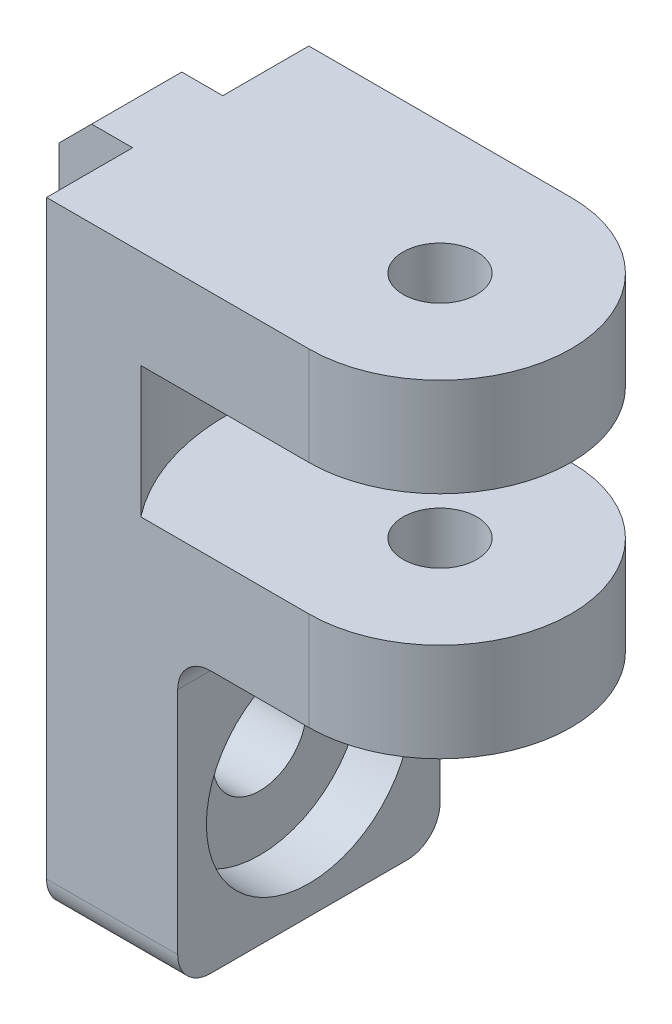
ISO-10303-21;
HEADER;
FILE_DESCRIPTION(('STEP AP214'),'2;1');
FILE_NAME('part.step','',(''),(''),'','','');
FILE_SCHEMA(('AUTOMOTIVE_DESIGN { 1 0 10303 214 1 1 1 1 }'));
ENDSEC;
DATA;
#1=APPLICATION_CONTEXT('core data for automotive mechanical design processes');
#2=APPLICATION_PROTOCOL_DEFINITION('international standard','automotive_design',2000,#1);
#3=PRODUCT_CONTEXT('',#1,'mechanical');
#4=PRODUCT('Part','Part','',(#3));
#5=PRODUCT_RELATED_PRODUCT_CATEGORY('part','',(#4));
#6=PRODUCT_DEFINITION_FORMATION('','',#4);
#7=PRODUCT_DEFINITION_CONTEXT('part definition',#1,'design');
#8=PRODUCT_DEFINITION('design','',#6,#7);
#9=PRODUCT_DEFINITION_SHAPE('','',#8);
#10=(LENGTH_UNIT() NAMED_UNIT(*) SI_UNIT(.MILLI.,.METRE.));
#11=(NAMED_UNIT(*) PLANE_ANGLE_UNIT() SI_UNIT($,.RADIAN.));
#12=(NAMED_UNIT(*) SI_UNIT($,.STERADIAN.) SOLID_ANGLE_UNIT());
#13=UNCERTAINTY_MEASURE_WITH_UNIT(LENGTH_MEASURE(1.E-05),#10,'distance_accuracy_value','');
#14=(GEOMETRIC_REPRESENTATION_CONTEXT(3) GLOBAL_UNCERTAINTY_ASSIGNED_CONTEXT((#13)) GLOBAL_UNIT_ASSIGNED_CONTEXT((#10,
#11,#12)) REPRESENTATION_CONTEXT('',''));
#15=CARTESIAN_POINT('',(0.,0.,0.));
#16=DIRECTION('',(0.,0.,1.));
#17=DIRECTION('',(1.,0.,0.));
#18=AXIS2_PLACEMENT_3D('',#15,#16,#17);
#19=CARTESIAN_POINT('',(8.,-2.08853598023942,48.8465560011747));
#20=DIRECTION('',(0.,0.,-1.));
#21=DIRECTION('',(-1.,0.,0.));
#22=AXIS2_PLACEMENT_3D('',#19,#20,#21);
#23=PLANE('',#22);
#24=DIRECTION('',(0.,-1.,0.));
#25=VECTOR('',#24,1.);
#26=CARTESIAN_POINT('',(0.,-2.08853598023942,48.8465560011747));
#27=LINE('',#26,#25);
#28=CARTESIAN_POINT('',(0.,35.9114640197606,48.8465560011747));
#29=VERTEX_POINT('',#28);
#30=CARTESIAN_POINT('',(0.,-0.0885359802394229,48.8465560011747));
#31=VERTEX_POINT('',#30);
#32=EDGE_CURVE('E302',#29,#31,#27,.T.);
#33=ORIENTED_EDGE('',*,*,#32,.T.);
#34=DIRECTION('',(-1.,0.,0.));
#35=VECTOR('',#34,1.);
#36=CARTESIAN_POINT('',(8.,-0.0885359802394229,48.8465560011747));
#37=LINE('',#36,#35);
#38=CARTESIAN_POINT('',(8.,-0.0885359802394229,48.8465560011747));
#39=VERTEX_POINT('',#38);
#40=EDGE_CURVE('E11',#31,#39,#37,.F.);
#41=ORIENTED_EDGE('',*,*,#40,.T.);
#42=DIRECTION('',(0.,-1.,0.));
#43=VECTOR('',#42,1.);
#44=CARTESIAN_POINT('',(8.,-2.08853598023942,48.8465560011747));
#45=LINE('',#44,#43);
#46=CARTESIAN_POINT('',(8.,13.9114640197606,48.8465560011747));
#47=VERTEX_POINT('',#46);
#48=EDGE_CURVE('E309',#47,#39,#45,.T.);
#49=ORIENTED_EDGE('',*,*,#48,.F.);
#50=CARTESIAN_POINT('',(10.,13.9114640197606,48.8465560011747));
#51=DIRECTION('',(0.,0.,-1.));
#52=DIRECTION('',(-1.,0.,0.));
#53=AXIS2_PLACEMENT_3D('',#50,#51,#52);
#54=CIRCLE('',#53,2.);
#55=CARTESIAN_POINT('',(10.,15.9114640197606,48.8465560011747));
#56=VERTEX_POINT('',#55);
#57=EDGE_CURVE('E265',#47,#56,#54,.T.);
#58=ORIENTED_EDGE('',*,*,#57,.T.);
#59=DIRECTION('',(-1.,0.,0.));
#60=VECTOR('',#59,1.);
#61=CARTESIAN_POINT('',(8.,15.9114640197606,48.8465560011747));
#62=LINE('',#61,#60);
#63=CARTESIAN_POINT('',(16.,15.9114640197606,48.8465560011747));
#64=VERTEX_POINT('',#63);
#65=EDGE_CURVE('E225',#64,#56,#62,.T.);
#66=ORIENTED_EDGE('',*,*,#65,.F.);
#67=DIRECTION('',(0.,1.,0.));
#68=VECTOR('',#67,1.);
#69=CARTESIAN_POINT('',(16.,15.9114640197606,48.8465560011747));
#70=LINE('',#69,#68);
#71=CARTESIAN_POINT('',(16.,21.9114640197606,48.8465560011747));
#72=VERTEX_POINT('',#71);
#73=EDGE_CURVE('E231',#64,#72,#70,.T.);
#74=ORIENTED_EDGE('',*,*,#73,.T.);
#75=DIRECTION('',(1.,0.,0.));
#76=VECTOR('',#75,1.);
#77=CARTESIAN_POINT('',(8.,21.9114640197606,48.8465560011747));
#78=LINE('',#77,#76);
#79=CARTESIAN_POINT('',(5.7530492340404,21.9114640197606,48.8465560011747));
#80=VERTEX_POINT('',#79);
#81=EDGE_CURVE('E202',#80,#72,#78,.T.);
#82=ORIENTED_EDGE('',*,*,#81,.F.);
#83=DIRECTION('',(0.,1.,0.));
#84=VECTOR('',#83,1.);
#85=CARTESIAN_POINT('',(5.7530492340404,21.9114640197606,48.8465560011747));
#86=LINE('',#85,#84);
#87=CARTESIAN_POINT('',(5.7530492340404,29.9114640197606,48.8465560011747));
#88=VERTEX_POINT('',#87);
#89=EDGE_CURVE('E204',#80,#88,#86,.T.);
#90=ORIENTED_EDGE('',*,*,#89,.T.);
#91=DIRECTION('',(1.,0.,0.));
#92=VECTOR('',#91,1.);
#93=CARTESIAN_POINT('',(8.,29.9114640197606,48.8465560011747));
#94=LINE('',#93,#92);
#95=CARTESIAN_POINT('',(16.,29.9114640197606,48.8465560011747));
#96=VERTEX_POINT('',#95);
#97=EDGE_CURVE('E184',#88,#96,#94,.T.);
#98=ORIENTED_EDGE('',*,*,#97,.T.);
#99=CARTESIAN_POINT('',(16.,35.9114640197606,48.8465560011747));
#100=VERTEX_POINT('',#99);
#101=EDGE_CURVE('E228',#96,#100,#70,.T.);
#102=ORIENTED_EDGE('',*,*,#101,.T.);
#103=DIRECTION('',(-1.,0.,0.));
#104=VECTOR('',#103,1.);
#105=CARTESIAN_POINT('',(8.,35.9114640197606,48.8465560011747));
#106=LINE('',#105,#104);
#107=EDGE_CURVE('E260',#100,#29,#106,.T.);
#108=ORIENTED_EDGE('',*,*,#107,.T.);
#109=EDGE_LOOP('',(#33,#41,#49,#58,#66,#74,#82,#90,#98,#102,#108));
#110=FACE_BOUND('',#109,.T.);
#111=ADVANCED_FACE('F32',(#110),#23,.F.);
#112=CARTESIAN_POINT('',(8.,35.9114640197606,32.8465560011747));
#113=DIRECTION('',(0.,0.,1.));
#114=DIRECTION('',(1.,0.,0.));
#115=AXIS2_PLACEMENT_3D('',#112,#113,#114);
#116=PLANE('',#115);
#117=DIRECTION('',(0.,1.,0.));
#118=VECTOR('',#117,1.);
#119=CARTESIAN_POINT('',(8.,35.9114640197606,32.8465560011747));
#120=LINE('',#119,#118);
#121=CARTESIAN_POINT('',(8.,-0.0885359802394181,32.8465560011747));
#122=VERTEX_POINT('',#121);
#123=CARTESIAN_POINT('',(8.,13.9114640197606,32.8465560011747));
#124=VERTEX_POINT('',#123);
#125=EDGE_CURVE('E300',#122,#124,#120,.T.);
#126=ORIENTED_EDGE('',*,*,#125,.F.);
#127=DIRECTION('',(-1.,0.,0.));
#128=VECTOR('',#127,1.);
#129=CARTESIAN_POINT('',(8.,-0.0885359802394181,32.8465560011747));
#130=LINE('',#129,#128);
#131=CARTESIAN_POINT('',(0.,-0.0885359802394181,32.8465560011747));
#132=VERTEX_POINT('',#131);
#133=EDGE_CURVE('E176',#122,#132,#130,.T.);
#134=ORIENTED_EDGE('',*,*,#133,.T.);
#135=DIRECTION('',(0.,1.,0.));
#136=VECTOR('',#135,1.);
#137=CARTESIAN_POINT('',(0.,35.9114640197606,32.8465560011747));
#138=LINE('',#137,#136);
#139=CARTESIAN_POINT('',(0.,35.9114640197606,32.8465560011747));
#140=VERTEX_POINT('',#139);
#141=EDGE_CURVE('E307',#132,#140,#138,.T.);
#142=ORIENTED_EDGE('',*,*,#141,.T.);
#143=DIRECTION('',(-1.,0.,0.));
#144=VECTOR('',#143,1.);
#145=CARTESIAN_POINT('',(8.,35.9114640197606,32.8465560011747));
#146=LINE('',#145,#144);
#147=CARTESIAN_POINT('',(16.,35.9114640197606,32.8465560011747));
#148=VERTEX_POINT('',#147);
#149=EDGE_CURVE('E310',#148,#140,#146,.T.);
#150=ORIENTED_EDGE('',*,*,#149,.F.);
#151=DIRECTION('',(0.,1.,0.));
#152=VECTOR('',#151,1.);
#153=CARTESIAN_POINT('',(16.,15.9114640197606,32.8465560011747));
#154=LINE('',#153,#152);
#155=CARTESIAN_POINT('',(16.,29.9114640197606,32.8465560011747));
#156=VERTEX_POINT('',#155);
#157=EDGE_CURVE('E190',#156,#148,#154,.T.);
#158=ORIENTED_EDGE('',*,*,#157,.F.);
#159=DIRECTION('',(-1.,0.,0.));
#160=VECTOR('',#159,1.);
#161=CARTESIAN_POINT('',(8.,29.9114640197606,32.8465560011747));
#162=LINE('',#161,#160);
#163=CARTESIAN_POINT('',(5.7530492340404,29.9114640197606,32.8465560011747));
#164=VERTEX_POINT('',#163);
#165=EDGE_CURVE('E181',#156,#164,#162,.T.);
#166=ORIENTED_EDGE('',*,*,#165,.T.);
#167=DIRECTION('',(0.,1.,0.));
#168=VECTOR('',#167,1.);
#169=CARTESIAN_POINT('',(5.7530492340404,21.9114640197606,32.8465560011747));
#170=LINE('',#169,#168);
#171=CARTESIAN_POINT('',(5.7530492340404,21.9114640197606,32.8465560011747));
#172=VERTEX_POINT('',#171);
#173=EDGE_CURVE('E166',#164,#172,#170,.F.);
#174=ORIENTED_EDGE('',*,*,#173,.T.);
#175=DIRECTION('',(-1.,0.,0.));
#176=VECTOR('',#175,1.);
#177=CARTESIAN_POINT('',(8.,21.9114640197606,32.8465560011747));
#178=LINE('',#177,#176);
#179=CARTESIAN_POINT('',(16.,21.9114640197606,32.8465560011747));
#180=VERTEX_POINT('',#179);
#181=EDGE_CURVE('E200',#180,#172,#178,.T.);
#182=ORIENTED_EDGE('',*,*,#181,.F.);
#183=CARTESIAN_POINT('',(16.,15.9114640197606,32.8465560011747));
#184=VERTEX_POINT('',#183);
#185=EDGE_CURVE('E234',#184,#180,#154,.T.);
#186=ORIENTED_EDGE('',*,*,#185,.F.);
#187=DIRECTION('',(1.,0.,0.));
#188=VECTOR('',#187,1.);
#189=CARTESIAN_POINT('',(16.,15.9114640197606,32.8465560011747));
#190=LINE('',#189,#188);
#191=CARTESIAN_POINT('',(10.,15.9114640197606,32.8465560011747));
#192=VERTEX_POINT('',#191);
#193=EDGE_CURVE('E221',#192,#184,#190,.T.);
#194=ORIENTED_EDGE('',*,*,#193,.F.);
#195=CARTESIAN_POINT('',(10.,13.9114640197606,32.8465560011747));
#196=DIRECTION('',(0.,0.,1.));
#197=DIRECTION('',(1.,0.,0.));
#198=AXIS2_PLACEMENT_3D('',#195,#196,#197);
#199=CIRCLE('',#198,2.);
#200=EDGE_CURVE('E262',#192,#124,#199,.T.);
#201=ORIENTED_EDGE('',*,*,#200,.T.);
#202=EDGE_LOOP('',(#126,#134,#142,#150,#158,#166,#174,#182,#186,#194,#201));
#203=FACE_BOUND('',#202,.T.);
#204=ADVANCED_FACE('F188',(#203),#116,.F.);
#205=CARTESIAN_POINT('',(16.,15.9114640197606,40.8465560011747));
#206=DIRECTION('',(0.,1.,0.));
#207=DIRECTION('',(0.,0.,1.));
#208=AXIS2_PLACEMENT_3D('',#205,#206,#207);
#209=CYLINDRICAL_SURFACE('',#208,8.);
#210=CARTESIAN_POINT('',(16.,21.9114640197606,40.8465560011747));
#211=DIRECTION('',(0.,1.,0.));
#212=DIRECTION('',(0.,0.,1.));
#213=AXIS2_PLACEMENT_3D('',#210,#211,#212);
#214=CIRCLE('',#213,8.);
#215=EDGE_CURVE('E198',#72,#180,#214,.T.);
#216=ORIENTED_EDGE('',*,*,#215,.F.);
#217=ORIENTED_EDGE('',*,*,#73,.F.);
#218=CARTESIAN_POINT('',(16.,15.9114640197606,40.8465560011747));
#219=DIRECTION('',(0.,-1.,0.));
#220=DIRECTION('',(0.,0.,-1.));
#221=AXIS2_PLACEMENT_3D('',#218,#219,#220);
#222=CIRCLE('',#221,8.);
#223=EDGE_CURVE('E223',#184,#64,#222,.T.);
#224=ORIENTED_EDGE('',*,*,#223,.F.);
#225=ORIENTED_EDGE('',*,*,#185,.T.);
#226=EDGE_LOOP('',(#216,#217,#224,#225));
#227=FACE_BOUND('',#226,.T.);
#228=ADVANCED_FACE('F401',(#227),#209,.T.);
#229=CARTESIAN_POINT('',(16.,15.9114640197606,40.8465560011747));
#230=DIRECTION('',(0.,1.,0.));
#231=DIRECTION('',(0.,0.,1.));
#232=AXIS2_PLACEMENT_3D('',#229,#230,#231);
#233=CYLINDRICAL_SURFACE('',#232,2.25);
#234=CARTESIAN_POINT('',(16.,15.9114640197606,40.8465560011747));
#235=DIRECTION('',(0.,-1.,0.));
#236=DIRECTION('',(0.,0.,-1.));
#237=AXIS2_PLACEMENT_3D('',#234,#235,#236);
#238=CIRCLE('',#237,2.25);
#239=CARTESIAN_POINT('',(16.,15.9114640197606,38.5965560011747));
#240=VERTEX_POINT('',#239);
#241=EDGE_CURVE('E213',#240,#240,#238,.T.);
#242=ORIENTED_EDGE('',*,*,#241,.T.);
#243=EDGE_LOOP('',(#242));
#244=FACE_BOUND('',#243,.T.);
#245=CARTESIAN_POINT('',(16.,21.9114640197606,40.8465560011747));
#246=DIRECTION('',(0.,1.,0.));
#247=DIRECTION('',(0.,0.,1.));
#248=AXIS2_PLACEMENT_3D('',#245,#246,#247);
#249=CIRCLE('',#248,2.25);
#250=CARTESIAN_POINT('',(16.,21.9114640197606,43.0965560011747));
#251=VERTEX_POINT('',#250);
#252=EDGE_CURVE('E193',#251,#251,#249,.T.);
#253=ORIENTED_EDGE('',*,*,#252,.T.);
#254=EDGE_LOOP('',(#253));
#255=FACE_BOUND('',#254,.T.);
#256=ADVANCED_FACE('F520',(#244,#255),#233,.F.);
#257=CARTESIAN_POINT('',(-2.,5.91146401976058,40.8465560011747));
#258=DIRECTION('',(1.,0.,0.));
#259=DIRECTION('',(0.,0.,-1.));
#260=AXIS2_PLACEMENT_3D('',#257,#258,#259);
#261=CYLINDRICAL_SURFACE('',#260,2.85);
#262=CARTESIAN_POINT('',(0.,5.91146401976058,40.8465560011747));
#263=DIRECTION('',(-1.,0.,0.));
#264=DIRECTION('',(0.,0.,1.));
#265=AXIS2_PLACEMENT_3D('',#262,#263,#264);
#266=CIRCLE('',#265,2.85);
#267=CARTESIAN_POINT('',(0.,5.91146401976058,43.6965560011747));
#268=VERTEX_POINT('',#267);
#269=EDGE_CURVE('E220',#268,#268,#266,.T.);
#270=ORIENTED_EDGE('',*,*,#269,.T.);
#271=EDGE_LOOP('',(#270));
#272=FACE_BOUND('',#271,.T.);
#273=CARTESIAN_POINT('',(5.,5.91146401976058,40.8465560011747));
#274=DIRECTION('',(1.,0.,0.));
#275=DIRECTION('',(0.,0.,-1.));
#276=AXIS2_PLACEMENT_3D('',#273,#274,#275);
#277=CIRCLE('',#276,2.85);
#278=CARTESIAN_POINT('',(5.,5.91146401976058,37.9965560011747));
#279=VERTEX_POINT('',#278);
#280=EDGE_CURVE('E210',#279,#279,#277,.F.);
#281=ORIENTED_EDGE('',*,*,#280,.F.);
#282=EDGE_LOOP('',(#281));
#283=FACE_BOUND('',#282,.T.);
#284=ADVANCED_FACE('F476',(#272,#283),#261,.F.);
#285=CARTESIAN_POINT('',(8.,0.,0.));
#286=DIRECTION('',(-1.,0.,0.));
#287=DIRECTION('',(0.,0.,1.));
#288=AXIS2_PLACEMENT_3D('',#285,#286,#287);
#289=PLANE('',#288);
#290=CARTESIAN_POINT('',(8.,5.91146401976058,40.8465560011747));
#291=DIRECTION('',(1.,0.,0.));
#292=DIRECTION('',(0.,0.,-1.));
#293=AXIS2_PLACEMENT_3D('',#290,#291,#292);
#294=CIRCLE('',#293,6.25);
#295=CARTESIAN_POINT('',(8.,5.91146401976058,34.5965560011747));
#296=VERTEX_POINT('',#295);
#297=EDGE_CURVE('E206',#296,#296,#294,.T.);
#298=ORIENTED_EDGE('',*,*,#297,.F.);
#299=EDGE_LOOP('',(#298));
#300=FACE_BOUND('',#299,.T.);
#301=DIRECTION('',(0.,0.,-1.));
#302=VECTOR('',#301,1.);
#303=CARTESIAN_POINT('',(8.,-2.08853598023942,32.8465560011747));
#304=LINE('',#303,#302);
#305=CARTESIAN_POINT('',(8.,-2.08853598023942,46.8465560011747));
#306=VERTEX_POINT('',#305);
#307=CARTESIAN_POINT('',(8.,-2.08853598023942,34.8465560011747));
#308=VERTEX_POINT('',#307);
#309=EDGE_CURVE('E369',#306,#308,#304,.T.);
#310=ORIENTED_EDGE('',*,*,#309,.T.);
#311=CARTESIAN_POINT('',(8.,-0.0885359802394181,34.8465560011747));
#312=DIRECTION('',(-1.,0.,0.));
#313=DIRECTION('',(0.,0.,1.));
#314=AXIS2_PLACEMENT_3D('',#311,#312,#313);
#315=CIRCLE('',#314,2.);
#316=EDGE_CURVE('E40',#308,#122,#315,.F.);
#317=ORIENTED_EDGE('',*,*,#316,.T.);
#318=ORIENTED_EDGE('',*,*,#125,.T.);
#319=DIRECTION('',(0.,0.,-1.));
#320=VECTOR('',#319,1.);
#321=CARTESIAN_POINT('',(8.,13.9114640197606,0.));
#322=LINE('',#321,#320);
#323=EDGE_CURVE('E259',#124,#47,#322,.F.);
#324=ORIENTED_EDGE('',*,*,#323,.T.);
#325=ORIENTED_EDGE('',*,*,#48,.T.);
#326=CARTESIAN_POINT('',(8.,-0.088535980239423,46.8465560011747));
#327=DIRECTION('',(-1.,0.,0.));
#328=DIRECTION('',(0.,0.,1.));
#329=AXIS2_PLACEMENT_3D('',#326,#327,#328);
#330=CIRCLE('',#329,2.);
#331=EDGE_CURVE('E365',#39,#306,#330,.F.);
#332=ORIENTED_EDGE('',*,*,#331,.T.);
#333=EDGE_LOOP('',(#310,#317,#318,#324,#325,#332));
#334=FACE_BOUND('',#333,.T.);
#335=ADVANCED_FACE('F368',(#300,#334),#289,.F.);
#336=CARTESIAN_POINT('',(8.,35.9114640197606,48.8465560011747));
#337=DIRECTION('',(0.,-1.,0.));
#338=DIRECTION('',(0.,0.,-1.));
#339=AXIS2_PLACEMENT_3D('',#336,#337,#338);
#340=PLANE('',#339);
#341=DIRECTION('',(1.,0.,0.));
#342=VECTOR('',#341,1.);
#343=CARTESIAN_POINT('',(-4.5,35.9114640197606,38.0965560011746));
#344=LINE('',#343,#342);
#345=CARTESIAN_POINT('',(-2.5,35.9114640197606,38.0965560011746));
#346=VERTEX_POINT('',#345);
#347=CARTESIAN_POINT('',(0.,35.9114640197606,38.0965560011746));
#348=VERTEX_POINT('',#347);
#349=EDGE_CURVE('E277',#346,#348,#344,.T.);
#350=ORIENTED_EDGE('',*,*,#349,.F.);
#351=DIRECTION('',(0.,0.,1.));
#352=VECTOR('',#351,1.);
#353=CARTESIAN_POINT('',(-2.5,35.9114640197606,43.5965560011746));
#354=LINE('',#353,#352);
#355=CARTESIAN_POINT('',(-2.5,35.9114640197606,43.5965560011746));
#356=VERTEX_POINT('',#355);
#357=EDGE_CURVE('E177',#346,#356,#354,.T.);
#358=ORIENTED_EDGE('',*,*,#357,.T.);
#359=DIRECTION('',(1.,0.,0.));
#360=VECTOR('',#359,1.);
#361=CARTESIAN_POINT('',(-4.5,35.9114640197606,43.5965560011746));
#362=LINE('',#361,#360);
#363=CARTESIAN_POINT('',(0.,35.9114640197606,43.5965560011747));
#364=VERTEX_POINT('',#363);
#365=EDGE_CURVE('E274',#356,#364,#362,.T.);
#366=ORIENTED_EDGE('',*,*,#365,.T.);
#367=DIRECTION('',(0.,0.,1.));
#368=VECTOR('',#367,1.);
#369=CARTESIAN_POINT('',(0.,35.9114640197606,48.8465560011747));
#370=LINE('',#369,#368);
#371=EDGE_CURVE('E276',#364,#29,#370,.T.);
#372=ORIENTED_EDGE('',*,*,#371,.T.);
#373=ORIENTED_EDGE('',*,*,#107,.F.);
#374=CARTESIAN_POINT('',(16.,35.9114640197606,40.8465560011747));
#375=DIRECTION('',(0.,-1.,0.));
#376=DIRECTION('',(0.,0.,-1.));
#377=AXIS2_PLACEMENT_3D('',#374,#375,#376);
#378=CIRCLE('',#377,8.);
#379=EDGE_CURVE('E216',#148,#100,#378,.T.);
#380=ORIENTED_EDGE('',*,*,#379,.F.);
#381=ORIENTED_EDGE('',*,*,#149,.T.);
#382=EDGE_CURVE('E295',#140,#348,#370,.T.);
#383=ORIENTED_EDGE('',*,*,#382,.T.);
#384=EDGE_LOOP('',(#350,#358,#366,#372,#373,#380,#381,#383));
#385=FACE_BOUND('',#384,.T.);
#386=CARTESIAN_POINT('',(16.,35.9114640197606,40.8465560011747));
#387=DIRECTION('',(0.,-1.,0.));
#388=DIRECTION('',(0.,0.,-1.));
#389=AXIS2_PLACEMENT_3D('',#386,#387,#388);
#390=CIRCLE('',#389,2.25);
#391=CARTESIAN_POINT('',(16.,35.9114640197606,38.5965560011747));
#392=VERTEX_POINT('',#391);
#393=EDGE_CURVE('E217',#392,#392,#390,.T.);
#394=ORIENTED_EDGE('',*,*,#393,.T.);
#395=EDGE_LOOP('',(#394));
#396=FACE_BOUND('',#395,.T.);
#397=ADVANCED_FACE('F319',(#385,#396),#340,.F.);
#398=CARTESIAN_POINT('',(8.,-2.08853598023942,32.8465560011747));
#399=DIRECTION('',(0.,1.,0.));
#400=DIRECTION('',(0.,0.,1.));
#401=AXIS2_PLACEMENT_3D('',#398,#399,#400);
#402=PLANE('',#401);
#403=DIRECTION('',(0.,0.,-1.));
#404=VECTOR('',#403,1.);
#405=CARTESIAN_POINT('',(0.,-2.08853598023942,32.8465560011747));
#406=LINE('',#405,#404);
#407=CARTESIAN_POINT('',(0.,-2.08853598023942,46.8465560011747));
#408=VERTEX_POINT('',#407);
#409=CARTESIAN_POINT('',(0.,-2.08853598023942,34.8465560011747));
#410=VERTEX_POINT('',#409);
#411=EDGE_CURVE('E305',#408,#410,#406,.T.);
#412=ORIENTED_EDGE('',*,*,#411,.T.);
#413=DIRECTION('',(-1.,0.,0.));
#414=VECTOR('',#413,1.);
#415=CARTESIAN_POINT('',(8.,-2.08853598023942,34.8465560011747));
#416=LINE('',#415,#414);
#417=EDGE_CURVE('E53',#410,#308,#416,.F.);
#418=ORIENTED_EDGE('',*,*,#417,.T.);
#419=ORIENTED_EDGE('',*,*,#309,.F.);
#420=DIRECTION('',(-1.,0.,0.));
#421=VECTOR('',#420,1.);
#422=CARTESIAN_POINT('',(8.,-2.08853598023942,46.8465560011747));
#423=LINE('',#422,#421);
#424=EDGE_CURVE('E361',#306,#408,#423,.T.);
#425=ORIENTED_EDGE('',*,*,#424,.T.);
#426=EDGE_LOOP('',(#412,#418,#419,#425));
#427=FACE_BOUND('',#426,.T.);
#428=ADVANCED_FACE('F376',(#427),#402,.F.);
#429=CARTESIAN_POINT('',(0.,0.,0.));
#430=DIRECTION('',(-1.,0.,0.));
#431=DIRECTION('',(0.,0.,1.));
#432=AXIS2_PLACEMENT_3D('',#429,#430,#431);
#433=PLANE('',#432);
#434=ORIENTED_EDGE('',*,*,#269,.F.);
#435=EDGE_LOOP('',(#434));
#436=FACE_BOUND('',#435,.T.);
#437=ORIENTED_EDGE('',*,*,#141,.F.);
#438=CARTESIAN_POINT('',(0.,-0.0885359802394181,34.8465560011747));
#439=DIRECTION('',(-1.,0.,0.));
#440=DIRECTION('',(0.,0.,1.));
#441=AXIS2_PLACEMENT_3D('',#438,#439,#440);
#442=CIRCLE('',#441,2.);
#443=EDGE_CURVE('E359',#132,#410,#442,.T.);
#444=ORIENTED_EDGE('',*,*,#443,.T.);
#445=ORIENTED_EDGE('',*,*,#411,.F.);
#446=CARTESIAN_POINT('',(0.,-0.088535980239423,46.8465560011747));
#447=DIRECTION('',(-1.,0.,0.));
#448=DIRECTION('',(0.,0.,1.));
#449=AXIS2_PLACEMENT_3D('',#446,#447,#448);
#450=CIRCLE('',#449,2.);
#451=EDGE_CURVE('E357',#408,#31,#450,.T.);
#452=ORIENTED_EDGE('',*,*,#451,.T.);
#453=ORIENTED_EDGE('',*,*,#32,.F.);
#454=ORIENTED_EDGE('',*,*,#371,.F.);
#455=DIRECTION('',(0.,1.,0.));
#456=VECTOR('',#455,1.);
#457=CARTESIAN_POINT('',(0.,35.9114640197606,43.5965560011746));
#458=LINE('',#457,#456);
#459=CARTESIAN_POINT('',(0.,13.9114640197606,43.5965560011747));
#460=VERTEX_POINT('',#459);
#461=EDGE_CURVE('E237',#460,#364,#458,.T.);
#462=ORIENTED_EDGE('',*,*,#461,.F.);
#463=DIRECTION('',(0.,0.,1.));
#464=VECTOR('',#463,1.);
#465=CARTESIAN_POINT('',(0.,13.9114640197606,38.0965560011747));
#466=LINE('',#465,#464);
#467=CARTESIAN_POINT('',(0.,13.9114640197606,38.0965560011747));
#468=VERTEX_POINT('',#467);
#469=EDGE_CURVE('E242',#468,#460,#466,.T.);
#470=ORIENTED_EDGE('',*,*,#469,.F.);
#471=DIRECTION('',(0.,-1.,0.));
#472=VECTOR('',#471,1.);
#473=CARTESIAN_POINT('',(0.,35.9114640197606,38.0965560011746));
#474=LINE('',#473,#472);
#475=EDGE_CURVE('E253',#348,#468,#474,.T.);
#476=ORIENTED_EDGE('',*,*,#475,.F.);
#477=ORIENTED_EDGE('',*,*,#382,.F.);
#478=EDGE_LOOP('',(#437,#444,#445,#452,#453,#454,#462,#470,#476,#477));
#479=FACE_BOUND('',#478,.T.);
#480=ADVANCED_FACE('F330',(#436,#479),#433,.T.);
#481=CARTESIAN_POINT('',(-4.5,35.9114640197606,43.5965560011746));
#482=DIRECTION('',(0.,0.,-1.));
#483=DIRECTION('',(0.,1.,0.));
#484=AXIS2_PLACEMENT_3D('',#481,#482,#483);
#485=PLANE('',#484);
#486=DIRECTION('',(0.,1.,0.));
#487=VECTOR('',#486,1.);
#488=CARTESIAN_POINT('',(-4.5,35.9114640197606,43.5965560011746));
#489=LINE('',#488,#487);
#490=CARTESIAN_POINT('',(-4.5,15.9114640197606,43.5965560011747));
#491=VERTEX_POINT('',#490);
#492=CARTESIAN_POINT('',(-4.5,33.9114640197606,43.5965560011746));
#493=VERTEX_POINT('',#492);
#494=EDGE_CURVE('E238',#491,#493,#489,.T.);
#495=ORIENTED_EDGE('',*,*,#494,.F.);
#496=DIRECTION('',(0.707106781186548,-0.707106781186548,0.));
#497=VECTOR('',#496,1.);
#498=CARTESIAN_POINT('',(-4.50000000000001,15.9114640197606,43.5965560011747));
#499=LINE('',#498,#497);
#500=CARTESIAN_POINT('',(-2.5,13.9114640197606,43.5965560011747));
#501=VERTEX_POINT('',#500);
#502=EDGE_CURVE('E279',#491,#501,#499,.T.);
#503=ORIENTED_EDGE('',*,*,#502,.T.);
#504=DIRECTION('',(1.,0.,0.));
#505=VECTOR('',#504,1.);
#506=CARTESIAN_POINT('',(-4.5,13.9114640197606,43.5965560011747));
#507=LINE('',#506,#505);
#508=EDGE_CURVE('E245',#501,#460,#507,.T.);
#509=ORIENTED_EDGE('',*,*,#508,.T.);
#510=ORIENTED_EDGE('',*,*,#461,.T.);
#511=ORIENTED_EDGE('',*,*,#365,.F.);
#512=DIRECTION('',(-0.707106781186547,-0.707106781186548,0.));
#513=VECTOR('',#512,1.);
#514=CARTESIAN_POINT('',(-4.49999999999999,33.9114640197606,43.5965560011746));
#515=LINE('',#514,#513);
#516=EDGE_CURVE('E273',#356,#493,#515,.T.);
#517=ORIENTED_EDGE('',*,*,#516,.T.);
#518=EDGE_LOOP('',(#495,#503,#509,#510,#511,#517));
#519=FACE_BOUND('',#518,.T.);
#520=ADVANCED_FACE('F382',(#519),#485,.F.);
#521=CARTESIAN_POINT('',(-4.5,35.9114640197606,38.0965560011746));
#522=DIRECTION('',(0.,0.,1.));
#523=DIRECTION('',(0.,-1.,0.));
#524=AXIS2_PLACEMENT_3D('',#521,#522,#523);
#525=PLANE('',#524);
#526=DIRECTION('',(1.,0.,0.));
#527=VECTOR('',#526,1.);
#528=CARTESIAN_POINT('',(-4.5,13.9114640197606,38.0965560011747));
#529=LINE('',#528,#527);
#530=CARTESIAN_POINT('',(-2.5,13.9114640197606,38.0965560011747));
#531=VERTEX_POINT('',#530);
#532=EDGE_CURVE('E285',#531,#468,#529,.T.);
#533=ORIENTED_EDGE('',*,*,#532,.F.);
#534=DIRECTION('',(-0.707106781186548,0.707106781186548,0.));
#535=VECTOR('',#534,1.);
#536=CARTESIAN_POINT('',(-4.50000000000001,15.9114640197606,38.0965560011747));
#537=LINE('',#536,#535);
#538=CARTESIAN_POINT('',(-4.5,15.9114640197606,38.0965560011747));
#539=VERTEX_POINT('',#538);
#540=EDGE_CURVE('E345',#531,#539,#537,.T.);
#541=ORIENTED_EDGE('',*,*,#540,.T.);
#542=DIRECTION('',(0.,-1.,0.));
#543=VECTOR('',#542,1.);
#544=CARTESIAN_POINT('',(-4.5,35.9114640197606,38.0965560011746));
#545=LINE('',#544,#543);
#546=CARTESIAN_POINT('',(-4.5,33.9114640197606,38.0965560011746));
#547=VERTEX_POINT('',#546);
#548=EDGE_CURVE('E241',#547,#539,#545,.T.);
#549=ORIENTED_EDGE('',*,*,#548,.F.);
#550=DIRECTION('',(0.707106781186547,0.707106781186548,0.));
#551=VECTOR('',#550,1.);
#552=CARTESIAN_POINT('',(-4.49999999999999,33.9114640197606,38.0965560011746));
#553=LINE('',#552,#551);
#554=EDGE_CURVE('E283',#547,#346,#553,.T.);
#555=ORIENTED_EDGE('',*,*,#554,.T.);
#556=ORIENTED_EDGE('',*,*,#349,.T.);
#557=ORIENTED_EDGE('',*,*,#475,.T.);
#558=EDGE_LOOP('',(#533,#541,#549,#555,#556,#557));
#559=FACE_BOUND('',#558,.T.);
#560=ADVANCED_FACE('F336',(#559),#525,.F.);
#561=CARTESIAN_POINT('',(-4.5,13.9114640197606,38.0965560011747));
#562=DIRECTION('',(0.,1.,0.));
#563=DIRECTION('',(0.,0.,1.));
#564=AXIS2_PLACEMENT_3D('',#561,#562,#563);
#565=PLANE('',#564);
#566=ORIENTED_EDGE('',*,*,#508,.F.);
#567=DIRECTION('',(0.,0.,-1.));
#568=VECTOR('',#567,1.);
#569=CARTESIAN_POINT('',(-2.5,13.9114640197606,38.0965560011747));
#570=LINE('',#569,#568);
#571=EDGE_CURVE('E281',#501,#531,#570,.T.);
#572=ORIENTED_EDGE('',*,*,#571,.T.);
#573=ORIENTED_EDGE('',*,*,#532,.T.);
#574=ORIENTED_EDGE('',*,*,#469,.T.);
#575=EDGE_LOOP('',(#566,#572,#573,#574));
#576=FACE_BOUND('',#575,.T.);
#577=ADVANCED_FACE('F590',(#576),#565,.F.);
#578=CARTESIAN_POINT('',(-4.5,0.,0.));
#579=DIRECTION('',(-1.,0.,0.));
#580=DIRECTION('',(0.,0.,1.));
#581=AXIS2_PLACEMENT_3D('',#578,#579,#580);
#582=PLANE('',#581);
#583=ORIENTED_EDGE('',*,*,#548,.T.);
#584=DIRECTION('',(0.,0.,1.));
#585=VECTOR('',#584,1.);
#586=CARTESIAN_POINT('',(-4.5,15.9114640197606,43.5965560011747));
#587=LINE('',#586,#585);
#588=EDGE_CURVE('E270',#539,#491,#587,.T.);
#589=ORIENTED_EDGE('',*,*,#588,.T.);
#590=ORIENTED_EDGE('',*,*,#494,.T.);
#591=DIRECTION('',(0.,0.,-1.));
#592=VECTOR('',#591,1.);
#593=CARTESIAN_POINT('',(-4.5,33.9114640197606,38.0965560011746));
#594=LINE('',#593,#592);
#595=EDGE_CURVE('E267',#493,#547,#594,.T.);
#596=ORIENTED_EDGE('',*,*,#595,.T.);
#597=EDGE_LOOP('',(#583,#589,#590,#596));
#598=FACE_BOUND('',#597,.T.);
#599=ADVANCED_FACE('F586',(#598),#582,.T.);
#600=CARTESIAN_POINT('',(16.,15.9114640197606,40.8465560011747));
#601=DIRECTION('',(0.,-1.,0.));
#602=DIRECTION('',(0.,0.,-1.));
#603=AXIS2_PLACEMENT_3D('',#600,#601,#602);
#604=PLANE('',#603);
#605=ORIENTED_EDGE('',*,*,#65,.T.);
#606=DIRECTION('',(0.,0.,-1.));
#607=VECTOR('',#606,1.);
#608=CARTESIAN_POINT('',(10.,15.9114640197606,40.8465560011747));
#609=LINE('',#608,#607);
#610=EDGE_CURVE('E256',#56,#192,#609,.T.);
#611=ORIENTED_EDGE('',*,*,#610,.T.);
#612=ORIENTED_EDGE('',*,*,#193,.T.);
#613=ORIENTED_EDGE('',*,*,#223,.T.);
#614=EDGE_LOOP('',(#605,#611,#612,#613));
#615=FACE_BOUND('',#614,.T.);
#616=ORIENTED_EDGE('',*,*,#241,.F.);
#617=EDGE_LOOP('',(#616));
#618=FACE_BOUND('',#617,.T.);
#619=ADVANCED_FACE('F394',(#615,#618),#604,.T.);
#620=ORIENTED_EDGE('',*,*,#101,.F.);
#621=CARTESIAN_POINT('',(16.,29.9114640197606,40.8465560011747));
#622=DIRECTION('',(0.,1.,0.));
#623=DIRECTION('',(0.,0.,1.));
#624=AXIS2_PLACEMENT_3D('',#621,#622,#623);
#625=CIRCLE('',#624,8.);
#626=EDGE_CURVE('E191',#96,#156,#625,.T.);
#627=ORIENTED_EDGE('',*,*,#626,.T.);
#628=ORIENTED_EDGE('',*,*,#157,.T.);
#629=ORIENTED_EDGE('',*,*,#379,.T.);
#630=EDGE_LOOP('',(#620,#627,#628,#629));
#631=FACE_BOUND('',#630,.T.);
#632=ADVANCED_FACE('F323',(#631),#209,.T.);
#633=CARTESIAN_POINT('',(16.,29.9114640197606,40.8465560011747));
#634=DIRECTION('',(0.,1.,0.));
#635=DIRECTION('',(0.,0.,1.));
#636=AXIS2_PLACEMENT_3D('',#633,#634,#635);
#637=CIRCLE('',#636,2.25);
#638=CARTESIAN_POINT('',(16.,29.9114640197606,43.0965560011747));
#639=VERTEX_POINT('',#638);
#640=EDGE_CURVE('E195',#639,#639,#637,.T.);
#641=ORIENTED_EDGE('',*,*,#640,.F.);
#642=EDGE_LOOP('',(#641));
#643=FACE_BOUND('',#642,.T.);
#644=ORIENTED_EDGE('',*,*,#393,.F.);
#645=EDGE_LOOP('',(#644));
#646=FACE_BOUND('',#645,.T.);
#647=ADVANCED_FACE('F431',(#643,#646),#233,.F.);
#648=CARTESIAN_POINT('',(10.,13.9114640197606,40.8465560011747));
#649=DIRECTION('',(0.,0.,-1.));
#650=DIRECTION('',(0.,1.,0.));
#651=AXIS2_PLACEMENT_3D('',#648,#649,#650);
#652=CYLINDRICAL_SURFACE('',#651,2.);
#653=ORIENTED_EDGE('',*,*,#57,.F.);
#654=ORIENTED_EDGE('',*,*,#323,.F.);
#655=ORIENTED_EDGE('',*,*,#200,.F.);
#656=ORIENTED_EDGE('',*,*,#610,.F.);
#657=EDGE_LOOP('',(#653,#654,#655,#656));
#658=FACE_BOUND('',#657,.T.);
#659=ADVANCED_FACE('F392',(#658),#652,.F.);
#660=CARTESIAN_POINT('',(-4.5,15.9114640197606,0.));
#661=DIRECTION('',(-0.707106781186547,-0.707106781186547,0.));
#662=DIRECTION('',(0.,0.,-1.));
#663=AXIS2_PLACEMENT_3D('',#660,#661,#662);
#664=PLANE('',#663);
#665=ORIENTED_EDGE('',*,*,#540,.F.);
#666=ORIENTED_EDGE('',*,*,#571,.F.);
#667=ORIENTED_EDGE('',*,*,#502,.F.);
#668=ORIENTED_EDGE('',*,*,#588,.F.);
#669=EDGE_LOOP('',(#665,#666,#667,#668));
#670=FACE_BOUND('',#669,.T.);
#671=ADVANCED_FACE('F430',(#670),#664,.T.);
#672=CARTESIAN_POINT('',(-4.5,33.9114640197606,0.));
#673=DIRECTION('',(-0.707106781186548,0.707106781186547,0.));
#674=DIRECTION('',(0.,0.,1.));
#675=AXIS2_PLACEMENT_3D('',#672,#673,#674);
#676=PLANE('',#675);
#677=ORIENTED_EDGE('',*,*,#516,.F.);
#678=ORIENTED_EDGE('',*,*,#357,.F.);
#679=ORIENTED_EDGE('',*,*,#554,.F.);
#680=ORIENTED_EDGE('',*,*,#595,.F.);
#681=EDGE_LOOP('',(#677,#678,#679,#680));
#682=FACE_BOUND('',#681,.T.);
#683=ADVANCED_FACE('F343',(#682),#676,.T.);
#684=CARTESIAN_POINT('',(5.,5.91146401976058,40.8465560011747));
#685=DIRECTION('',(1.,0.,0.));
#686=DIRECTION('',(0.,0.,-1.));
#687=AXIS2_PLACEMENT_3D('',#684,#685,#686);
#688=PLANE('',#687);
#689=CARTESIAN_POINT('',(5.,5.91146401976058,40.8465560011747));
#690=DIRECTION('',(1.,0.,0.));
#691=DIRECTION('',(0.,0.,-1.));
#692=AXIS2_PLACEMENT_3D('',#689,#690,#691);
#693=CIRCLE('',#692,6.25);
#694=CARTESIAN_POINT('',(5.,5.91146401976058,34.5965560011747));
#695=VERTEX_POINT('',#694);
#696=EDGE_CURVE('E207',#695,#695,#693,.T.);
#697=ORIENTED_EDGE('',*,*,#696,.T.);
#698=EDGE_LOOP('',(#697));
#699=FACE_BOUND('',#698,.T.);
#700=ORIENTED_EDGE('',*,*,#280,.T.);
#701=EDGE_LOOP('',(#700));
#702=FACE_BOUND('',#701,.T.);
#703=ADVANCED_FACE('F436',(#699,#702),#688,.T.);
#704=CARTESIAN_POINT('',(5.,5.91146401976058,40.8465560011747));
#705=DIRECTION('',(1.,0.,0.));
#706=DIRECTION('',(0.,0.,-1.));
#707=AXIS2_PLACEMENT_3D('',#704,#705,#706);
#708=CYLINDRICAL_SURFACE('',#707,6.25);
#709=ORIENTED_EDGE('',*,*,#696,.F.);
#710=EDGE_LOOP('',(#709));
#711=FACE_BOUND('',#710,.T.);
#712=ORIENTED_EDGE('',*,*,#297,.T.);
#713=EDGE_LOOP('',(#712));
#714=FACE_BOUND('',#713,.T.);
#715=ADVANCED_FACE('F415',(#711,#714),#708,.F.);
#716=CARTESIAN_POINT('',(16.,21.9114640197606,40.8465560011747));
#717=DIRECTION('',(0.,1.,0.));
#718=DIRECTION('',(0.,0.,1.));
#719=AXIS2_PLACEMENT_3D('',#716,#717,#718);
#720=CYLINDRICAL_SURFACE('',#719,13.);
#721=CARTESIAN_POINT('',(16.,21.9114640197606,40.8465560011747));
#722=DIRECTION('',(0.,1.,0.));
#723=DIRECTION('',(0.,0.,1.));
#724=AXIS2_PLACEMENT_3D('',#721,#722,#723);
#725=CIRCLE('',#724,13.);
#726=EDGE_CURVE('E172',#172,#80,#725,.T.);
#727=ORIENTED_EDGE('',*,*,#726,.F.);
#728=ORIENTED_EDGE('',*,*,#173,.F.);
#729=CARTESIAN_POINT('',(16.,29.9114640197606,40.8465560011747));
#730=DIRECTION('',(0.,1.,0.));
#731=DIRECTION('',(0.,0.,1.));
#732=AXIS2_PLACEMENT_3D('',#729,#730,#731);
#733=CIRCLE('',#732,13.);
#734=EDGE_CURVE('E169',#164,#88,#733,.T.);
#735=ORIENTED_EDGE('',*,*,#734,.T.);
#736=ORIENTED_EDGE('',*,*,#89,.F.);
#737=EDGE_LOOP('',(#727,#728,#735,#736));
#738=FACE_BOUND('',#737,.T.);
#739=ADVANCED_FACE('F168',(#738),#720,.F.);
#740=CARTESIAN_POINT('',(16.,21.9114640197606,40.8465560011747));
#741=DIRECTION('',(0.,1.,0.));
#742=DIRECTION('',(0.,0.,1.));
#743=AXIS2_PLACEMENT_3D('',#740,#741,#742);
#744=PLANE('',#743);
#745=ORIENTED_EDGE('',*,*,#252,.F.);
#746=EDGE_LOOP('',(#745));
#747=FACE_BOUND('',#746,.T.);
#748=ORIENTED_EDGE('',*,*,#81,.T.);
#749=ORIENTED_EDGE('',*,*,#215,.T.);
#750=ORIENTED_EDGE('',*,*,#181,.T.);
#751=ORIENTED_EDGE('',*,*,#726,.T.);
#752=EDGE_LOOP('',(#748,#749,#750,#751));
#753=FACE_BOUND('',#752,.T.);
#754=ADVANCED_FACE('F404',(#747,#753),#744,.T.);
#755=CARTESIAN_POINT('',(16.,29.9114640197606,40.8465560011747));
#756=DIRECTION('',(0.,1.,0.));
#757=DIRECTION('',(0.,0.,1.));
#758=AXIS2_PLACEMENT_3D('',#755,#756,#757);
#759=PLANE('',#758);
#760=ORIENTED_EDGE('',*,*,#640,.T.);
#761=EDGE_LOOP('',(#760));
#762=FACE_BOUND('',#761,.T.);
#763=ORIENTED_EDGE('',*,*,#734,.F.);
#764=ORIENTED_EDGE('',*,*,#165,.F.);
#765=ORIENTED_EDGE('',*,*,#626,.F.);
#766=ORIENTED_EDGE('',*,*,#97,.F.);
#767=EDGE_LOOP('',(#763,#764,#765,#766));
#768=FACE_BOUND('',#767,.T.);
#769=ADVANCED_FACE('F180',(#762,#768),#759,.F.);
#770=CARTESIAN_POINT('',(8.,-0.0885359802394181,34.8465560011747));
#771=DIRECTION('',(-1.,0.,0.));
#772=DIRECTION('',(0.,0.,1.));
#773=AXIS2_PLACEMENT_3D('',#770,#771,#772);
#774=CYLINDRICAL_SURFACE('',#773,2.);
#775=ORIENTED_EDGE('',*,*,#316,.F.);
#776=ORIENTED_EDGE('',*,*,#417,.F.);
#777=ORIENTED_EDGE('',*,*,#443,.F.);
#778=ORIENTED_EDGE('',*,*,#133,.F.);
#779=EDGE_LOOP('',(#775,#776,#777,#778));
#780=FACE_BOUND('',#779,.T.);
#781=ADVANCED_FACE('F374',(#780),#774,.T.);
#782=CARTESIAN_POINT('',(8.,-0.088535980239423,46.8465560011747));
#783=DIRECTION('',(-1.,0.,0.));
#784=DIRECTION('',(0.,0.,1.));
#785=AXIS2_PLACEMENT_3D('',#782,#783,#784);
#786=CYLINDRICAL_SURFACE('',#785,2.);
#787=ORIENTED_EDGE('',*,*,#331,.F.);
#788=ORIENTED_EDGE('',*,*,#40,.F.);
#789=ORIENTED_EDGE('',*,*,#451,.F.);
#790=ORIENTED_EDGE('',*,*,#424,.F.);
#791=EDGE_LOOP('',(#787,#788,#789,#790));
#792=FACE_BOUND('',#791,.T.);
#793=ADVANCED_FACE('F34',(#792),#786,.T.);
#794=CLOSED_SHELL('',(#111,#204,#228,#256,#284,#335,#397,#428,#480,#520,#560,#577,#599,#619,
#632,#647,#659,#671,#683,#703,#715,#739,#754,#769,#781,#793));
#795=MANIFOLD_SOLID_BREP('B2',#794);
#796=ADVANCED_BREP_SHAPE_REPRESENTATION('',(#18,#795),#14);
#797=SHAPE_DEFINITION_REPRESENTATION(#9,#796);
ENDSEC;
END-ISO-10303-21;
